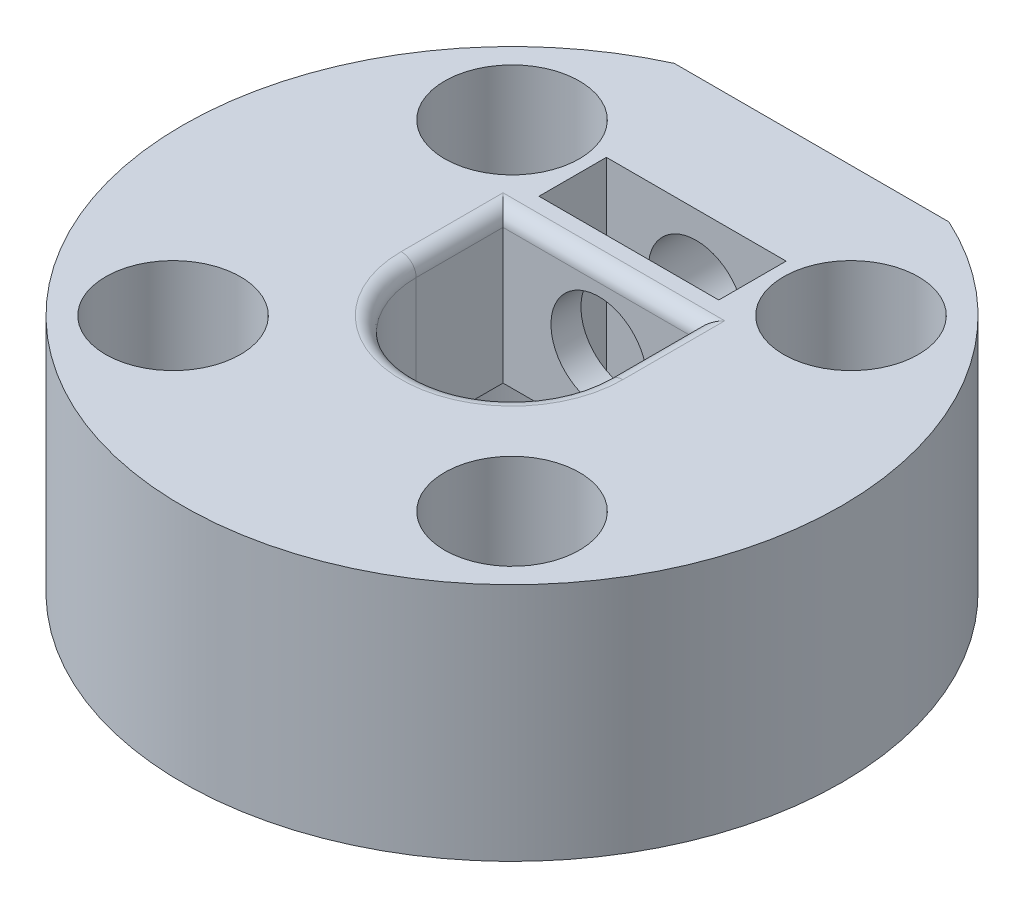
ISO-10303-21;
HEADER;
FILE_DESCRIPTION(('STEP AP214'),'2;1');
FILE_NAME('part.step','',(''),(''),'','','');
FILE_SCHEMA(('AUTOMOTIVE_DESIGN { 1 0 10303 214 1 1 1 1 }'));
ENDSEC;
DATA;
#1=APPLICATION_CONTEXT('core data for automotive mechanical design processes');
#2=APPLICATION_PROTOCOL_DEFINITION('international standard','automotive_design',2000,#1);
#3=PRODUCT_CONTEXT('',#1,'mechanical');
#4=PRODUCT('Part','Part','',(#3));
#5=PRODUCT_RELATED_PRODUCT_CATEGORY('part','',(#4));
#6=PRODUCT_DEFINITION_FORMATION('','',#4);
#7=PRODUCT_DEFINITION_CONTEXT('part definition',#1,'design');
#8=PRODUCT_DEFINITION('design','',#6,#7);
#9=PRODUCT_DEFINITION_SHAPE('','',#8);
#10=(LENGTH_UNIT() NAMED_UNIT(*) SI_UNIT(.MILLI.,.METRE.));
#11=(NAMED_UNIT(*) PLANE_ANGLE_UNIT() SI_UNIT($,.RADIAN.));
#12=(NAMED_UNIT(*) SI_UNIT($,.STERADIAN.) SOLID_ANGLE_UNIT());
#13=UNCERTAINTY_MEASURE_WITH_UNIT(LENGTH_MEASURE(1.E-05),#10,'distance_accuracy_value','');
#14=(GEOMETRIC_REPRESENTATION_CONTEXT(3) GLOBAL_UNCERTAINTY_ASSIGNED_CONTEXT((#13)) GLOBAL_UNIT_ASSIGNED_CONTEXT((#10,
#11,#12)) REPRESENTATION_CONTEXT('',''));
#15=CARTESIAN_POINT('',(0.,0.,0.));
#16=DIRECTION('',(0.,0.,1.));
#17=DIRECTION('',(1.,0.,0.));
#18=AXIS2_PLACEMENT_3D('',#15,#16,#17);
#19=CARTESIAN_POINT('',(0.,8.,0.));
#20=DIRECTION('',(0.,-1.,0.));
#21=DIRECTION('',(0.,0.,-1.));
#22=AXIS2_PLACEMENT_3D('',#19,#20,#21);
#23=CYLINDRICAL_SURFACE('',#22,3.2);
#24=DIRECTION('',(0.,-1.,0.));
#25=VECTOR('',#24,1.);
#26=CARTESIAN_POINT('',(3.2,8.,0.));
#27=LINE('',#26,#25);
#28=CARTESIAN_POINT('',(3.2,7.5,0.));
#29=VERTEX_POINT('',#28);
#30=CARTESIAN_POINT('',(3.2,3.,0.));
#31=VERTEX_POINT('',#30);
#32=EDGE_CURVE('E245',#29,#31,#27,.T.);
#33=ORIENTED_EDGE('',*,*,#32,.T.);
#34=CARTESIAN_POINT('',(0.,3.,0.));
#35=DIRECTION('',(0.,-1.,0.));
#36=DIRECTION('',(0.,0.,-1.));
#37=AXIS2_PLACEMENT_3D('',#34,#35,#36);
#38=CIRCLE('',#37,3.2);
#39=CARTESIAN_POINT('',(-3.2,3.,0.));
#40=VERTEX_POINT('',#39);
#41=EDGE_CURVE('E143',#31,#40,#38,.T.);
#42=ORIENTED_EDGE('',*,*,#41,.T.);
#43=DIRECTION('',(0.,-1.,0.));
#44=VECTOR('',#43,1.);
#45=CARTESIAN_POINT('',(-3.2,8.,0.));
#46=LINE('',#45,#44);
#47=CARTESIAN_POINT('',(-3.2,7.5,0.));
#48=VERTEX_POINT('',#47);
#49=EDGE_CURVE('E236',#48,#40,#46,.T.);
#50=ORIENTED_EDGE('',*,*,#49,.F.);
#51=CARTESIAN_POINT('',(0.,7.5,0.));
#52=DIRECTION('',(0.,1.,0.));
#53=DIRECTION('',(0.,0.,1.));
#54=AXIS2_PLACEMENT_3D('',#51,#52,#53);
#55=CIRCLE('',#54,3.2);
#56=EDGE_CURVE('E280',#48,#29,#55,.T.);
#57=ORIENTED_EDGE('',*,*,#56,.T.);
#58=EDGE_LOOP('',(#33,#42,#50,#57));
#59=FACE_BOUND('',#58,.T.);
#60=ADVANCED_FACE('F35',(#59),#23,.F.);
#61=CARTESIAN_POINT('',(3.2,8.,0.));
#62=DIRECTION('',(-1.,0.,0.));
#63=DIRECTION('',(0.,0.,1.));
#64=AXIS2_PLACEMENT_3D('',#61,#62,#63);
#65=PLANE('',#64);
#66=DIRECTION('',(0.,-1.,0.));
#67=VECTOR('',#66,1.);
#68=CARTESIAN_POINT('',(3.2,8.,-2.9));
#69=LINE('',#68,#67);
#70=CARTESIAN_POINT('',(3.2,7.5,-2.9));
#71=VERTEX_POINT('',#70);
#72=CARTESIAN_POINT('',(3.2,3.,-2.9));
#73=VERTEX_POINT('',#72);
#74=EDGE_CURVE('E242',#71,#73,#69,.T.);
#75=ORIENTED_EDGE('',*,*,#74,.T.);
#76=DIRECTION('',(0.,0.,1.));
#77=VECTOR('',#76,1.);
#78=CARTESIAN_POINT('',(3.2,3.,0.));
#79=LINE('',#78,#77);
#80=EDGE_CURVE('E429',#73,#31,#79,.T.);
#81=ORIENTED_EDGE('',*,*,#80,.T.);
#82=ORIENTED_EDGE('',*,*,#32,.F.);
#83=DIRECTION('',(0.,0.,-1.));
#84=VECTOR('',#83,1.);
#85=CARTESIAN_POINT('',(3.2,7.5,0.));
#86=LINE('',#85,#84);
#87=EDGE_CURVE('E276',#29,#71,#86,.T.);
#88=ORIENTED_EDGE('',*,*,#87,.T.);
#89=EDGE_LOOP('',(#75,#81,#82,#88));
#90=FACE_BOUND('',#89,.T.);
#91=ADVANCED_FACE('F352',(#90),#65,.T.);
#92=CARTESIAN_POINT('',(3.2,8.,-2.9));
#93=DIRECTION('',(0.,0.,1.));
#94=DIRECTION('',(1.,0.,0.));
#95=AXIS2_PLACEMENT_3D('',#92,#93,#94);
#96=PLANE('',#95);
#97=CARTESIAN_POINT('',(0.,5.5,-2.9));
#98=DIRECTION('',(0.,0.,1.));
#99=DIRECTION('',(1.,0.,0.));
#100=AXIS2_PLACEMENT_3D('',#97,#98,#99);
#101=CIRCLE('',#100,1.6);
#102=CARTESIAN_POINT('',(1.6,5.5,-2.9));
#103=VERTEX_POINT('',#102);
#104=EDGE_CURVE('E185',#103,#103,#101,.T.);
#105=ORIENTED_EDGE('',*,*,#104,.F.);
#106=EDGE_LOOP('',(#105));
#107=FACE_BOUND('',#106,.T.);
#108=DIRECTION('',(0.,-1.,0.));
#109=VECTOR('',#108,1.);
#110=CARTESIAN_POINT('',(-3.2,8.,-2.9));
#111=LINE('',#110,#109);
#112=CARTESIAN_POINT('',(-3.2,7.5,-2.9));
#113=VERTEX_POINT('',#112);
#114=CARTESIAN_POINT('',(-3.2,3.,-2.9));
#115=VERTEX_POINT('',#114);
#116=EDGE_CURVE('E239',#113,#115,#111,.T.);
#117=ORIENTED_EDGE('',*,*,#116,.T.);
#118=DIRECTION('',(1.,0.,0.));
#119=VECTOR('',#118,1.);
#120=CARTESIAN_POINT('',(3.2,3.,-2.9));
#121=LINE('',#120,#119);
#122=EDGE_CURVE('E50',#115,#73,#121,.T.);
#123=ORIENTED_EDGE('',*,*,#122,.T.);
#124=ORIENTED_EDGE('',*,*,#74,.F.);
#125=DIRECTION('',(-1.,0.,0.));
#126=VECTOR('',#125,1.);
#127=CARTESIAN_POINT('',(3.2,7.5,-2.9));
#128=LINE('',#127,#126);
#129=EDGE_CURVE('E278',#71,#113,#128,.T.);
#130=ORIENTED_EDGE('',*,*,#129,.T.);
#131=EDGE_LOOP('',(#117,#123,#124,#130));
#132=FACE_BOUND('',#131,.T.);
#133=ADVANCED_FACE('F358',(#107,#132),#96,.T.);
#134=CARTESIAN_POINT('',(-3.2,8.,0.));
#135=DIRECTION('',(1.,0.,0.));
#136=DIRECTION('',(0.,0.,-1.));
#137=AXIS2_PLACEMENT_3D('',#134,#135,#136);
#138=PLANE('',#137);
#139=ORIENTED_EDGE('',*,*,#49,.T.);
#140=DIRECTION('',(0.,0.,-1.));
#141=VECTOR('',#140,1.);
#142=CARTESIAN_POINT('',(-3.2,3.,0.));
#143=LINE('',#142,#141);
#144=EDGE_CURVE('E437',#40,#115,#143,.T.);
#145=ORIENTED_EDGE('',*,*,#144,.T.);
#146=ORIENTED_EDGE('',*,*,#116,.F.);
#147=DIRECTION('',(0.,0.,1.));
#148=VECTOR('',#147,1.);
#149=CARTESIAN_POINT('',(-3.2,7.5,0.));
#150=LINE('',#149,#148);
#151=EDGE_CURVE('E264',#113,#48,#150,.T.);
#152=ORIENTED_EDGE('',*,*,#151,.T.);
#153=EDGE_LOOP('',(#139,#145,#146,#152));
#154=FACE_BOUND('',#153,.T.);
#155=ADVANCED_FACE('F364',(#154),#138,.T.);
#156=CARTESIAN_POINT('',(-3.,0.,-3.9));
#157=DIRECTION('',(0.,0.,1.));
#158=DIRECTION('',(1.,0.,0.));
#159=AXIS2_PLACEMENT_3D('',#156,#157,#158);
#160=PLANE('',#159);
#161=CARTESIAN_POINT('',(0.,5.5,-3.9));
#162=DIRECTION('',(0.,0.,1.));
#163=DIRECTION('',(1.,0.,0.));
#164=AXIS2_PLACEMENT_3D('',#161,#162,#163);
#165=CIRCLE('',#164,1.6);
#166=CARTESIAN_POINT('',(1.6,5.5,-3.9));
#167=VERTEX_POINT('',#166);
#168=EDGE_CURVE('E186',#167,#167,#165,.F.);
#169=ORIENTED_EDGE('',*,*,#168,.F.);
#170=EDGE_LOOP('',(#169));
#171=FACE_BOUND('',#170,.T.);
#172=DIRECTION('',(1.,0.,0.));
#173=VECTOR('',#172,1.);
#174=CARTESIAN_POINT('',(-3.,3.,-3.9));
#175=LINE('',#174,#173);
#176=CARTESIAN_POINT('',(-3.,3.,-3.9));
#177=VERTEX_POINT('',#176);
#178=CARTESIAN_POINT('',(3.,3.,-3.9));
#179=VERTEX_POINT('',#178);
#180=EDGE_CURVE('E299',#177,#179,#175,.T.);
#181=ORIENTED_EDGE('',*,*,#180,.F.);
#182=DIRECTION('',(0.,1.,0.));
#183=VECTOR('',#182,1.);
#184=CARTESIAN_POINT('',(-3.,0.,-3.9));
#185=LINE('',#184,#183);
#186=CARTESIAN_POINT('',(-3.,8.,-3.9));
#187=VERTEX_POINT('',#186);
#188=EDGE_CURVE('E177',#177,#187,#185,.T.);
#189=ORIENTED_EDGE('',*,*,#188,.T.);
#190=DIRECTION('',(1.,0.,0.));
#191=VECTOR('',#190,1.);
#192=CARTESIAN_POINT('',(-3.,8.,-3.9));
#193=LINE('',#192,#191);
#194=CARTESIAN_POINT('',(3.,8.,-3.9));
#195=VERTEX_POINT('',#194);
#196=EDGE_CURVE('E159',#187,#195,#193,.T.);
#197=ORIENTED_EDGE('',*,*,#196,.T.);
#198=DIRECTION('',(0.,1.,0.));
#199=VECTOR('',#198,1.);
#200=CARTESIAN_POINT('',(3.,0.,-3.9));
#201=LINE('',#200,#199);
#202=EDGE_CURVE('E174',#179,#195,#201,.T.);
#203=ORIENTED_EDGE('',*,*,#202,.F.);
#204=EDGE_LOOP('',(#181,#189,#197,#203));
#205=FACE_BOUND('',#204,.T.);
#206=ADVANCED_FACE('F304',(#171,#205),#160,.F.);
#207=CARTESIAN_POINT('',(0.,5.5,-10.));
#208=DIRECTION('',(0.,0.,1.));
#209=DIRECTION('',(1.,0.,0.));
#210=AXIS2_PLACEMENT_3D('',#207,#208,#209);
#211=CYLINDRICAL_SURFACE('',#210,1.6);
#212=ORIENTED_EDGE('',*,*,#168,.T.);
#213=EDGE_LOOP('',(#212));
#214=FACE_BOUND('',#213,.T.);
#215=ORIENTED_EDGE('',*,*,#104,.T.);
#216=EDGE_LOOP('',(#215));
#217=FACE_BOUND('',#216,.T.);
#218=ADVANCED_FACE('F328',(#214,#217),#211,.F.);
#219=CARTESIAN_POINT('',(0.,8.,0.));
#220=DIRECTION('',(0.,1.,0.));
#221=DIRECTION('',(0.,0.,1.));
#222=AXIS2_PLACEMENT_3D('',#219,#220,#221);
#223=PLANE('',#222);
#224=DIRECTION('',(0.,0.,-1.));
#225=VECTOR('',#224,1.);
#226=CARTESIAN_POINT('',(3.,8.,-3.9));
#227=LINE('',#226,#225);
#228=CARTESIAN_POINT('',(3.,8.,-6.15));
#229=VERTEX_POINT('',#228);
#230=EDGE_CURVE('E142',#195,#229,#227,.T.);
#231=ORIENTED_EDGE('',*,*,#230,.F.);
#232=ORIENTED_EDGE('',*,*,#196,.F.);
#233=DIRECTION('',(0.,0.,1.));
#234=VECTOR('',#233,1.);
#235=CARTESIAN_POINT('',(-3.,8.,-3.9));
#236=LINE('',#235,#234);
#237=CARTESIAN_POINT('',(-3.,8.,-6.15));
#238=VERTEX_POINT('',#237);
#239=EDGE_CURVE('E163',#238,#187,#236,.T.);
#240=ORIENTED_EDGE('',*,*,#239,.F.);
#241=DIRECTION('',(-1.,0.,0.));
#242=VECTOR('',#241,1.);
#243=CARTESIAN_POINT('',(-3.,8.,-6.15));
#244=LINE('',#243,#242);
#245=EDGE_CURVE('E169',#229,#238,#244,.T.);
#246=ORIENTED_EDGE('',*,*,#245,.F.);
#247=EDGE_LOOP('',(#231,#232,#240,#246));
#248=FACE_BOUND('',#247,.T.);
#249=DIRECTION('',(0.,0.,1.));
#250=VECTOR('',#249,1.);
#251=CARTESIAN_POINT('',(-3.7,8.,0.));
#252=LINE('',#251,#250);
#253=CARTESIAN_POINT('',(-3.7,8.,0.));
#254=VERTEX_POINT('',#253);
#255=CARTESIAN_POINT('',(-3.7,8.,-3.4));
#256=VERTEX_POINT('',#255);
#257=EDGE_CURVE('E271',#254,#256,#252,.F.);
#258=ORIENTED_EDGE('',*,*,#257,.T.);
#259=DIRECTION('',(-1.,0.,0.));
#260=VECTOR('',#259,1.);
#261=CARTESIAN_POINT('',(0.,8.,-3.4));
#262=LINE('',#261,#260);
#263=CARTESIAN_POINT('',(3.7,8.,-3.4));
#264=VERTEX_POINT('',#263);
#265=EDGE_CURVE('E274',#256,#264,#262,.F.);
#266=ORIENTED_EDGE('',*,*,#265,.T.);
#267=DIRECTION('',(0.,0.,-1.));
#268=VECTOR('',#267,1.);
#269=CARTESIAN_POINT('',(3.7,8.,0.));
#270=LINE('',#269,#268);
#271=CARTESIAN_POINT('',(3.7,8.,0.));
#272=VERTEX_POINT('',#271);
#273=EDGE_CURVE('E269',#264,#272,#270,.F.);
#274=ORIENTED_EDGE('',*,*,#273,.T.);
#275=CARTESIAN_POINT('',(0.,8.,0.));
#276=DIRECTION('',(0.,1.,0.));
#277=DIRECTION('',(0.,0.,1.));
#278=AXIS2_PLACEMENT_3D('',#275,#276,#277);
#279=CIRCLE('',#278,3.7);
#280=EDGE_CURVE('E267',#272,#254,#279,.F.);
#281=ORIENTED_EDGE('',*,*,#280,.T.);
#282=EDGE_LOOP('',(#258,#266,#274,#281));
#283=FACE_BOUND('',#282,.T.);
#284=CARTESIAN_POINT('',(5.65685424949237,8.,-5.65685424949239));
#285=DIRECTION('',(0.,1.,0.));
#286=DIRECTION('',(0.,0.,1.));
#287=AXIS2_PLACEMENT_3D('',#284,#285,#286);
#288=CIRCLE('',#287,2.25);
#289=CARTESIAN_POINT('',(5.65685424949237,8.,-3.40685424949239));
#290=VERTEX_POINT('',#289);
#291=EDGE_CURVE('E187',#290,#290,#288,.T.);
#292=ORIENTED_EDGE('',*,*,#291,.F.);
#293=EDGE_LOOP('',(#292));
#294=FACE_BOUND('',#293,.T.);
#295=CARTESIAN_POINT('',(5.65685424949239,8.,5.65685424949237));
#296=DIRECTION('',(0.,1.,0.));
#297=DIRECTION('',(0.,0.,1.));
#298=AXIS2_PLACEMENT_3D('',#295,#296,#297);
#299=CIRCLE('',#298,2.25);
#300=CARTESIAN_POINT('',(5.65685424949239,8.,7.90685424949237));
#301=VERTEX_POINT('',#300);
#302=EDGE_CURVE('E200',#301,#301,#299,.T.);
#303=ORIENTED_EDGE('',*,*,#302,.F.);
#304=EDGE_LOOP('',(#303));
#305=FACE_BOUND('',#304,.T.);
#306=CARTESIAN_POINT('',(-5.65685424949237,8.,5.65685424949239));
#307=DIRECTION('',(0.,1.,0.));
#308=DIRECTION('',(0.,0.,1.));
#309=AXIS2_PLACEMENT_3D('',#306,#307,#308);
#310=CIRCLE('',#309,2.25);
#311=CARTESIAN_POINT('',(-5.65685424949237,8.,7.90685424949239));
#312=VERTEX_POINT('',#311);
#313=EDGE_CURVE('E212',#312,#312,#310,.T.);
#314=ORIENTED_EDGE('',*,*,#313,.F.);
#315=EDGE_LOOP('',(#314));
#316=FACE_BOUND('',#315,.T.);
#317=CARTESIAN_POINT('',(-5.65685424949239,8.,-5.65685424949237));
#318=DIRECTION('',(0.,1.,0.));
#319=DIRECTION('',(0.,0.,1.));
#320=AXIS2_PLACEMENT_3D('',#317,#318,#319);
#321=CIRCLE('',#320,2.25);
#322=CARTESIAN_POINT('',(-5.65685424949239,8.,-3.40685424949237));
#323=VERTEX_POINT('',#322);
#324=EDGE_CURVE('E224',#323,#323,#321,.T.);
#325=ORIENTED_EDGE('',*,*,#324,.F.);
#326=EDGE_LOOP('',(#325));
#327=FACE_BOUND('',#326,.T.);
#328=CARTESIAN_POINT('',(0.,8.,0.));
#329=DIRECTION('',(0.,1.,0.));
#330=DIRECTION('',(0.,0.,1.));
#331=AXIS2_PLACEMENT_3D('',#328,#329,#330);
#332=CIRCLE('',#331,11.);
#333=CARTESIAN_POINT('',(-4.58257569495584,8.,-10.));
#334=VERTEX_POINT('',#333);
#335=CARTESIAN_POINT('',(4.58257569495584,8.,-10.));
#336=VERTEX_POINT('',#335);
#337=EDGE_CURVE('E249',#334,#336,#332,.T.);
#338=ORIENTED_EDGE('',*,*,#337,.T.);
#339=DIRECTION('',(-1.,0.,0.));
#340=VECTOR('',#339,1.);
#341=CARTESIAN_POINT('',(4.58257569495584,8.,-10.));
#342=LINE('',#341,#340);
#343=EDGE_CURVE('E252',#336,#334,#342,.T.);
#344=ORIENTED_EDGE('',*,*,#343,.T.);
#345=EDGE_LOOP('',(#338,#344));
#346=FACE_BOUND('',#345,.T.);
#347=ADVANCED_FACE('F314',(#248,#283,#294,#305,#316,#327,#346),#223,.T.);
#348=CARTESIAN_POINT('',(0.,0.,0.));
#349=DIRECTION('',(0.,1.,0.));
#350=DIRECTION('',(0.,0.,1.));
#351=AXIS2_PLACEMENT_3D('',#348,#349,#350);
#352=PLANE('',#351);
#353=DIRECTION('',(0.,0.,1.));
#354=VECTOR('',#353,1.);
#355=CARTESIAN_POINT('',(-3.,0.,-3.9));
#356=LINE('',#355,#354);
#357=CARTESIAN_POINT('',(-3.,0.,-6.15));
#358=VERTEX_POINT('',#357);
#359=CARTESIAN_POINT('',(-3.,0.,-4.60977222864679));
#360=VERTEX_POINT('',#359);
#361=EDGE_CURVE('E152',#358,#360,#356,.T.);
#362=ORIENTED_EDGE('',*,*,#361,.T.);
#363=CARTESIAN_POINT('',(-1.04093892556476E-12,0.,-1.26348062682966E-12));
#364=DIRECTION('',(0.,-1.,0.));
#365=DIRECTION('',(0.,0.,-1.));
#366=AXIS2_PLACEMENT_3D('',#363,#364,#365);
#367=CIRCLE('',#366,5.49999999999866);
#368=CARTESIAN_POINT('',(3.,0.,-4.60977222864543));
#369=VERTEX_POINT('',#368);
#370=EDGE_CURVE('E138',#369,#360,#367,.T.);
#371=ORIENTED_EDGE('',*,*,#370,.F.);
#372=DIRECTION('',(0.,0.,-1.));
#373=VECTOR('',#372,1.);
#374=CARTESIAN_POINT('',(3.,0.,-3.9));
#375=LINE('',#374,#373);
#376=CARTESIAN_POINT('',(3.,0.,-6.15));
#377=VERTEX_POINT('',#376);
#378=EDGE_CURVE('E150',#369,#377,#375,.T.);
#379=ORIENTED_EDGE('',*,*,#378,.T.);
#380=DIRECTION('',(-1.,0.,0.));
#381=VECTOR('',#380,1.);
#382=CARTESIAN_POINT('',(-3.,0.,-6.15));
#383=LINE('',#382,#381);
#384=EDGE_CURVE('E158',#377,#358,#383,.T.);
#385=ORIENTED_EDGE('',*,*,#384,.T.);
#386=EDGE_LOOP('',(#362,#371,#379,#385));
#387=FACE_BOUND('',#386,.T.);
#388=CARTESIAN_POINT('',(5.65685424949237,0.,-5.65685424949239));
#389=DIRECTION('',(0.,1.,0.));
#390=DIRECTION('',(0.,0.,1.));
#391=AXIS2_PLACEMENT_3D('',#388,#389,#390);
#392=CIRCLE('',#391,1.25);
#393=CARTESIAN_POINT('',(5.65685424949237,0.,-4.40685424949239));
#394=VERTEX_POINT('',#393);
#395=EDGE_CURVE('E197',#394,#394,#392,.T.);
#396=ORIENTED_EDGE('',*,*,#395,.T.);
#397=EDGE_LOOP('',(#396));
#398=FACE_BOUND('',#397,.T.);
#399=CARTESIAN_POINT('',(5.65685424949239,0.,5.65685424949237));
#400=DIRECTION('',(0.,1.,0.));
#401=DIRECTION('',(0.,0.,1.));
#402=AXIS2_PLACEMENT_3D('',#399,#400,#401);
#403=CIRCLE('',#402,1.25);
#404=CARTESIAN_POINT('',(5.65685424949239,0.,6.90685424949237));
#405=VERTEX_POINT('',#404);
#406=EDGE_CURVE('E209',#405,#405,#403,.T.);
#407=ORIENTED_EDGE('',*,*,#406,.T.);
#408=EDGE_LOOP('',(#407));
#409=FACE_BOUND('',#408,.T.);
#410=CARTESIAN_POINT('',(-5.65685424949237,0.,5.65685424949239));
#411=DIRECTION('',(0.,1.,0.));
#412=DIRECTION('',(0.,0.,1.));
#413=AXIS2_PLACEMENT_3D('',#410,#411,#412);
#414=CIRCLE('',#413,1.25);
#415=CARTESIAN_POINT('',(-5.65685424949237,0.,6.90685424949239));
#416=VERTEX_POINT('',#415);
#417=EDGE_CURVE('E221',#416,#416,#414,.T.);
#418=ORIENTED_EDGE('',*,*,#417,.T.);
#419=EDGE_LOOP('',(#418));
#420=FACE_BOUND('',#419,.T.);
#421=CARTESIAN_POINT('',(-5.65685424949239,0.,-5.65685424949237));
#422=DIRECTION('',(0.,1.,0.));
#423=DIRECTION('',(0.,0.,1.));
#424=AXIS2_PLACEMENT_3D('',#421,#422,#423);
#425=CIRCLE('',#424,1.25);
#426=CARTESIAN_POINT('',(-5.65685424949239,0.,-4.40685424949237));
#427=VERTEX_POINT('',#426);
#428=EDGE_CURVE('E233',#427,#427,#425,.T.);
#429=ORIENTED_EDGE('',*,*,#428,.T.);
#430=EDGE_LOOP('',(#429));
#431=FACE_BOUND('',#430,.T.);
#432=CARTESIAN_POINT('',(0.,0.,0.));
#433=DIRECTION('',(0.,1.,0.));
#434=DIRECTION('',(0.,0.,1.));
#435=AXIS2_PLACEMENT_3D('',#432,#433,#434);
#436=CIRCLE('',#435,11.);
#437=CARTESIAN_POINT('',(-4.58257569495584,0.,-10.));
#438=VERTEX_POINT('',#437);
#439=CARTESIAN_POINT('',(4.58257569495584,0.,-10.));
#440=VERTEX_POINT('',#439);
#441=EDGE_CURVE('E248',#438,#440,#436,.T.);
#442=ORIENTED_EDGE('',*,*,#441,.F.);
#443=DIRECTION('',(-1.,0.,0.));
#444=VECTOR('',#443,1.);
#445=CARTESIAN_POINT('',(4.58257569495584,0.,-10.));
#446=LINE('',#445,#444);
#447=EDGE_CURVE('E253',#440,#438,#446,.T.);
#448=ORIENTED_EDGE('',*,*,#447,.F.);
#449=EDGE_LOOP('',(#442,#448));
#450=FACE_BOUND('',#449,.T.);
#451=ADVANCED_FACE('F147',(#387,#398,#409,#420,#431,#450),#352,.F.);
#452=CARTESIAN_POINT('',(0.,8.,0.));
#453=DIRECTION('',(0.,-1.,0.));
#454=DIRECTION('',(0.,0.,-1.));
#455=AXIS2_PLACEMENT_3D('',#452,#453,#454);
#456=CYLINDRICAL_SURFACE('',#455,11.);
#457=ORIENTED_EDGE('',*,*,#441,.T.);
#458=DIRECTION('',(0.,-1.,0.));
#459=VECTOR('',#458,1.);
#460=CARTESIAN_POINT('',(4.58257569495584,8.,-10.));
#461=LINE('',#460,#459);
#462=EDGE_CURVE('E261',#336,#440,#461,.T.);
#463=ORIENTED_EDGE('',*,*,#462,.F.);
#464=ORIENTED_EDGE('',*,*,#337,.F.);
#465=DIRECTION('',(0.,-1.,0.));
#466=VECTOR('',#465,1.);
#467=CARTESIAN_POINT('',(-4.58257569495584,8.,-10.));
#468=LINE('',#467,#466);
#469=EDGE_CURVE('E255',#334,#438,#468,.T.);
#470=ORIENTED_EDGE('',*,*,#469,.T.);
#471=EDGE_LOOP('',(#457,#463,#464,#470));
#472=FACE_BOUND('',#471,.T.);
#473=ADVANCED_FACE('F335',(#472),#456,.T.);
#474=CARTESIAN_POINT('',(4.58257569495584,8.,-10.));
#475=DIRECTION('',(0.,0.,1.));
#476=DIRECTION('',(1.,0.,0.));
#477=AXIS2_PLACEMENT_3D('',#474,#475,#476);
#478=PLANE('',#477);
#479=CARTESIAN_POINT('',(0.,5.5,-10.));
#480=DIRECTION('',(0.,0.,1.));
#481=DIRECTION('',(1.,0.,0.));
#482=AXIS2_PLACEMENT_3D('',#479,#480,#481);
#483=CIRCLE('',#482,1.6);
#484=CARTESIAN_POINT('',(1.6,5.5,-10.));
#485=VERTEX_POINT('',#484);
#486=EDGE_CURVE('E182',#485,#485,#483,.T.);
#487=ORIENTED_EDGE('',*,*,#486,.T.);
#488=EDGE_LOOP('',(#487));
#489=FACE_BOUND('',#488,.T.);
#490=ORIENTED_EDGE('',*,*,#447,.T.);
#491=ORIENTED_EDGE('',*,*,#469,.F.);
#492=ORIENTED_EDGE('',*,*,#343,.F.);
#493=ORIENTED_EDGE('',*,*,#462,.T.);
#494=EDGE_LOOP('',(#490,#491,#492,#493));
#495=FACE_BOUND('',#494,.T.);
#496=ADVANCED_FACE('F331',(#489,#495),#478,.F.);
#497=CARTESIAN_POINT('',(-5.65685424949239,8.,-5.65685424949237));
#498=DIRECTION('',(0.,1.,0.));
#499=DIRECTION('',(0.,0.,1.));
#500=AXIS2_PLACEMENT_3D('',#497,#498,#499);
#501=CYLINDRICAL_SURFACE('',#500,1.25);
#502=ORIENTED_EDGE('',*,*,#428,.F.);
#503=EDGE_LOOP('',(#502));
#504=FACE_BOUND('',#503,.T.);
#505=CARTESIAN_POINT('',(-5.65685424949239,1.5,-5.65685424949237));
#506=DIRECTION('',(0.,1.,0.));
#507=DIRECTION('',(0.,0.,1.));
#508=AXIS2_PLACEMENT_3D('',#505,#506,#507);
#509=CIRCLE('',#508,1.25);
#510=CARTESIAN_POINT('',(-5.65685424949239,1.5,-4.40685424949237));
#511=VERTEX_POINT('',#510);
#512=EDGE_CURVE('E230',#511,#511,#509,.T.);
#513=ORIENTED_EDGE('',*,*,#512,.T.);
#514=EDGE_LOOP('',(#513));
#515=FACE_BOUND('',#514,.T.);
#516=ADVANCED_FACE('F334',(#504,#515),#501,.F.);
#517=CARTESIAN_POINT('',(-4.40685424949239,1.5,-5.65685424949237));
#518=DIRECTION('',(0.,-1.,0.));
#519=DIRECTION('',(0.,0.,-1.));
#520=AXIS2_PLACEMENT_3D('',#517,#518,#519);
#521=PLANE('',#520);
#522=ORIENTED_EDGE('',*,*,#512,.F.);
#523=EDGE_LOOP('',(#522));
#524=FACE_BOUND('',#523,.T.);
#525=CARTESIAN_POINT('',(-5.65685424949239,1.5,-5.65685424949237));
#526=DIRECTION('',(0.,1.,0.));
#527=DIRECTION('',(0.,0.,1.));
#528=AXIS2_PLACEMENT_3D('',#525,#526,#527);
#529=CIRCLE('',#528,2.25);
#530=CARTESIAN_POINT('',(-5.65685424949239,1.5,-3.40685424949237));
#531=VERTEX_POINT('',#530);
#532=EDGE_CURVE('E227',#531,#531,#529,.T.);
#533=ORIENTED_EDGE('',*,*,#532,.T.);
#534=EDGE_LOOP('',(#533));
#535=FACE_BOUND('',#534,.T.);
#536=ADVANCED_FACE('F371',(#524,#535),#521,.F.);
#537=CARTESIAN_POINT('',(-5.65685424949239,8.,-5.65685424949237));
#538=DIRECTION('',(0.,1.,0.));
#539=DIRECTION('',(0.,0.,1.));
#540=AXIS2_PLACEMENT_3D('',#537,#538,#539);
#541=CYLINDRICAL_SURFACE('',#540,2.25);
#542=ORIENTED_EDGE('',*,*,#532,.F.);
#543=EDGE_LOOP('',(#542));
#544=FACE_BOUND('',#543,.T.);
#545=ORIENTED_EDGE('',*,*,#324,.T.);
#546=EDGE_LOOP('',(#545));
#547=FACE_BOUND('',#546,.T.);
#548=ADVANCED_FACE('F375',(#544,#547),#541,.F.);
#549=CARTESIAN_POINT('',(-5.65685424949237,8.,5.65685424949239));
#550=DIRECTION('',(0.,1.,0.));
#551=DIRECTION('',(0.,0.,1.));
#552=AXIS2_PLACEMENT_3D('',#549,#550,#551);
#553=CYLINDRICAL_SURFACE('',#552,1.25);
#554=ORIENTED_EDGE('',*,*,#417,.F.);
#555=EDGE_LOOP('',(#554));
#556=FACE_BOUND('',#555,.T.);
#557=CARTESIAN_POINT('',(-5.65685424949237,1.5,5.65685424949239));
#558=DIRECTION('',(0.,1.,0.));
#559=DIRECTION('',(0.,0.,1.));
#560=AXIS2_PLACEMENT_3D('',#557,#558,#559);
#561=CIRCLE('',#560,1.25);
#562=CARTESIAN_POINT('',(-5.65685424949237,1.5,6.90685424949239));
#563=VERTEX_POINT('',#562);
#564=EDGE_CURVE('E218',#563,#563,#561,.T.);
#565=ORIENTED_EDGE('',*,*,#564,.T.);
#566=EDGE_LOOP('',(#565));
#567=FACE_BOUND('',#566,.T.);
#568=ADVANCED_FACE('F379',(#556,#567),#553,.F.);
#569=CARTESIAN_POINT('',(-4.40685424949237,1.5,5.65685424949239));
#570=DIRECTION('',(0.,-1.,0.));
#571=DIRECTION('',(0.,0.,-1.));
#572=AXIS2_PLACEMENT_3D('',#569,#570,#571);
#573=PLANE('',#572);
#574=ORIENTED_EDGE('',*,*,#564,.F.);
#575=EDGE_LOOP('',(#574));
#576=FACE_BOUND('',#575,.T.);
#577=CARTESIAN_POINT('',(-5.65685424949237,1.5,5.65685424949239));
#578=DIRECTION('',(0.,1.,0.));
#579=DIRECTION('',(0.,0.,1.));
#580=AXIS2_PLACEMENT_3D('',#577,#578,#579);
#581=CIRCLE('',#580,2.25);
#582=CARTESIAN_POINT('',(-5.65685424949237,1.5,7.90685424949239));
#583=VERTEX_POINT('',#582);
#584=EDGE_CURVE('E215',#583,#583,#581,.T.);
#585=ORIENTED_EDGE('',*,*,#584,.T.);
#586=EDGE_LOOP('',(#585));
#587=FACE_BOUND('',#586,.T.);
#588=ADVANCED_FACE('F383',(#576,#587),#573,.F.);
#589=CARTESIAN_POINT('',(-5.65685424949237,8.,5.65685424949239));
#590=DIRECTION('',(0.,1.,0.));
#591=DIRECTION('',(0.,0.,1.));
#592=AXIS2_PLACEMENT_3D('',#589,#590,#591);
#593=CYLINDRICAL_SURFACE('',#592,2.25);
#594=ORIENTED_EDGE('',*,*,#584,.F.);
#595=EDGE_LOOP('',(#594));
#596=FACE_BOUND('',#595,.T.);
#597=ORIENTED_EDGE('',*,*,#313,.T.);
#598=EDGE_LOOP('',(#597));
#599=FACE_BOUND('',#598,.T.);
#600=ADVANCED_FACE('F387',(#596,#599),#593,.F.);
#601=CARTESIAN_POINT('',(5.65685424949239,8.,5.65685424949237));
#602=DIRECTION('',(0.,1.,0.));
#603=DIRECTION('',(0.,0.,1.));
#604=AXIS2_PLACEMENT_3D('',#601,#602,#603);
#605=CYLINDRICAL_SURFACE('',#604,1.25);
#606=ORIENTED_EDGE('',*,*,#406,.F.);
#607=EDGE_LOOP('',(#606));
#608=FACE_BOUND('',#607,.T.);
#609=CARTESIAN_POINT('',(5.65685424949239,1.5,5.65685424949237));
#610=DIRECTION('',(0.,1.,0.));
#611=DIRECTION('',(0.,0.,1.));
#612=AXIS2_PLACEMENT_3D('',#609,#610,#611);
#613=CIRCLE('',#612,1.25);
#614=CARTESIAN_POINT('',(5.65685424949239,1.5,6.90685424949237));
#615=VERTEX_POINT('',#614);
#616=EDGE_CURVE('E206',#615,#615,#613,.T.);
#617=ORIENTED_EDGE('',*,*,#616,.T.);
#618=EDGE_LOOP('',(#617));
#619=FACE_BOUND('',#618,.T.);
#620=ADVANCED_FACE('F391',(#608,#619),#605,.F.);
#621=CARTESIAN_POINT('',(6.90685424949239,1.5,5.65685424949237));
#622=DIRECTION('',(0.,-1.,0.));
#623=DIRECTION('',(0.,0.,-1.));
#624=AXIS2_PLACEMENT_3D('',#621,#622,#623);
#625=PLANE('',#624);
#626=ORIENTED_EDGE('',*,*,#616,.F.);
#627=EDGE_LOOP('',(#626));
#628=FACE_BOUND('',#627,.T.);
#629=CARTESIAN_POINT('',(5.65685424949239,1.5,5.65685424949237));
#630=DIRECTION('',(0.,1.,0.));
#631=DIRECTION('',(0.,0.,1.));
#632=AXIS2_PLACEMENT_3D('',#629,#630,#631);
#633=CIRCLE('',#632,2.25);
#634=CARTESIAN_POINT('',(5.65685424949239,1.5,7.90685424949237));
#635=VERTEX_POINT('',#634);
#636=EDGE_CURVE('E203',#635,#635,#633,.T.);
#637=ORIENTED_EDGE('',*,*,#636,.T.);
#638=EDGE_LOOP('',(#637));
#639=FACE_BOUND('',#638,.T.);
#640=ADVANCED_FACE('F395',(#628,#639),#625,.F.);
#641=CARTESIAN_POINT('',(5.65685424949239,8.,5.65685424949237));
#642=DIRECTION('',(0.,1.,0.));
#643=DIRECTION('',(0.,0.,1.));
#644=AXIS2_PLACEMENT_3D('',#641,#642,#643);
#645=CYLINDRICAL_SURFACE('',#644,2.25);
#646=ORIENTED_EDGE('',*,*,#636,.F.);
#647=EDGE_LOOP('',(#646));
#648=FACE_BOUND('',#647,.T.);
#649=ORIENTED_EDGE('',*,*,#302,.T.);
#650=EDGE_LOOP('',(#649));
#651=FACE_BOUND('',#650,.T.);
#652=ADVANCED_FACE('F399',(#648,#651),#645,.F.);
#653=CARTESIAN_POINT('',(5.65685424949237,8.,-5.65685424949239));
#654=DIRECTION('',(0.,1.,0.));
#655=DIRECTION('',(0.,0.,1.));
#656=AXIS2_PLACEMENT_3D('',#653,#654,#655);
#657=CYLINDRICAL_SURFACE('',#656,1.25);
#658=ORIENTED_EDGE('',*,*,#395,.F.);
#659=EDGE_LOOP('',(#658));
#660=FACE_BOUND('',#659,.T.);
#661=CARTESIAN_POINT('',(5.65685424949237,1.5,-5.65685424949239));
#662=DIRECTION('',(0.,1.,0.));
#663=DIRECTION('',(0.,0.,1.));
#664=AXIS2_PLACEMENT_3D('',#661,#662,#663);
#665=CIRCLE('',#664,1.25);
#666=CARTESIAN_POINT('',(5.65685424949237,1.5,-4.40685424949239));
#667=VERTEX_POINT('',#666);
#668=EDGE_CURVE('E194',#667,#667,#665,.T.);
#669=ORIENTED_EDGE('',*,*,#668,.T.);
#670=EDGE_LOOP('',(#669));
#671=FACE_BOUND('',#670,.T.);
#672=ADVANCED_FACE('F403',(#660,#671),#657,.F.);
#673=CARTESIAN_POINT('',(6.90685424949237,1.5,-5.65685424949239));
#674=DIRECTION('',(0.,-1.,0.));
#675=DIRECTION('',(0.,0.,-1.));
#676=AXIS2_PLACEMENT_3D('',#673,#674,#675);
#677=PLANE('',#676);
#678=ORIENTED_EDGE('',*,*,#668,.F.);
#679=EDGE_LOOP('',(#678));
#680=FACE_BOUND('',#679,.T.);
#681=CARTESIAN_POINT('',(5.65685424949237,1.5,-5.65685424949239));
#682=DIRECTION('',(0.,1.,0.));
#683=DIRECTION('',(0.,0.,1.));
#684=AXIS2_PLACEMENT_3D('',#681,#682,#683);
#685=CIRCLE('',#684,2.25);
#686=CARTESIAN_POINT('',(5.65685424949237,1.5,-3.40685424949239));
#687=VERTEX_POINT('',#686);
#688=EDGE_CURVE('E190',#687,#687,#685,.T.);
#689=ORIENTED_EDGE('',*,*,#688,.T.);
#690=EDGE_LOOP('',(#689));
#691=FACE_BOUND('',#690,.T.);
#692=ADVANCED_FACE('F407',(#680,#691),#677,.F.);
#693=CARTESIAN_POINT('',(5.65685424949237,8.,-5.65685424949239));
#694=DIRECTION('',(0.,1.,0.));
#695=DIRECTION('',(0.,0.,1.));
#696=AXIS2_PLACEMENT_3D('',#693,#694,#695);
#697=CYLINDRICAL_SURFACE('',#696,2.25);
#698=ORIENTED_EDGE('',*,*,#688,.F.);
#699=EDGE_LOOP('',(#698));
#700=FACE_BOUND('',#699,.T.);
#701=ORIENTED_EDGE('',*,*,#291,.T.);
#702=EDGE_LOOP('',(#701));
#703=FACE_BOUND('',#702,.T.);
#704=ADVANCED_FACE('F411',(#700,#703),#697,.F.);
#705=CARTESIAN_POINT('',(3.7,7.5,0.));
#706=DIRECTION('',(0.,0.,-1.));
#707=DIRECTION('',(-1.,0.,0.));
#708=AXIS2_PLACEMENT_3D('',#705,#706,#707);
#709=CYLINDRICAL_SURFACE('',#708,0.5);
#710=CARTESIAN_POINT('',(3.7,7.5,0.));
#711=DIRECTION('',(0.,0.,1.));
#712=DIRECTION('',(1.,0.,0.));
#713=AXIS2_PLACEMENT_3D('',#710,#711,#712);
#714=CIRCLE('',#713,0.5);
#715=EDGE_CURVE('E286',#272,#29,#714,.T.);
#716=ORIENTED_EDGE('',*,*,#715,.F.);
#717=ORIENTED_EDGE('',*,*,#273,.F.);
#718=CARTESIAN_POINT('',(3.7,7.5,-3.4));
#719=DIRECTION('',(-0.707106781186548,0.,-0.707106781186547));
#720=DIRECTION('',(0.707106781186547,0.,-0.707106781186548));
#721=AXIS2_PLACEMENT_3D('',#718,#719,#720);
#722=ELLIPSE('',#721,0.707106781186547,0.5);
#723=EDGE_CURVE('E191',#71,#264,#722,.T.);
#724=ORIENTED_EDGE('',*,*,#723,.F.);
#725=ORIENTED_EDGE('',*,*,#87,.F.);
#726=EDGE_LOOP('',(#716,#717,#724,#725));
#727=FACE_BOUND('',#726,.T.);
#728=ADVANCED_FACE('F37',(#727),#709,.T.);
#729=CARTESIAN_POINT('',(3.2,7.5,-3.4));
#730=DIRECTION('',(-1.,0.,0.));
#731=DIRECTION('',(0.,0.,1.));
#732=AXIS2_PLACEMENT_3D('',#729,#730,#731);
#733=CYLINDRICAL_SURFACE('',#732,0.5);
#734=ORIENTED_EDGE('',*,*,#723,.T.);
#735=ORIENTED_EDGE('',*,*,#265,.F.);
#736=CARTESIAN_POINT('',(-3.7,7.5,-3.4));
#737=DIRECTION('',(-0.707106781186548,0.,0.707106781186547));
#738=DIRECTION('',(0.707106781186547,0.,0.707106781186548));
#739=AXIS2_PLACEMENT_3D('',#736,#737,#738);
#740=ELLIPSE('',#739,0.707106781186547,0.5);
#741=EDGE_CURVE('E284',#113,#256,#740,.T.);
#742=ORIENTED_EDGE('',*,*,#741,.F.);
#743=ORIENTED_EDGE('',*,*,#129,.F.);
#744=EDGE_LOOP('',(#734,#735,#742,#743));
#745=FACE_BOUND('',#744,.T.);
#746=ADVANCED_FACE('F456',(#745),#733,.T.);
#747=CARTESIAN_POINT('',(0.,7.5,0.));
#748=DIRECTION('',(0.,1.,0.));
#749=DIRECTION('',(0.,0.,1.));
#750=AXIS2_PLACEMENT_3D('',#747,#748,#749);
#751=TOROIDAL_SURFACE('',#750,3.7,0.5);
#752=ORIENTED_EDGE('',*,*,#715,.T.);
#753=ORIENTED_EDGE('',*,*,#56,.F.);
#754=CARTESIAN_POINT('',(-3.7,7.5,0.));
#755=DIRECTION('',(0.,0.,-1.));
#756=DIRECTION('',(-1.,0.,0.));
#757=AXIS2_PLACEMENT_3D('',#754,#755,#756);
#758=CIRCLE('',#757,0.5);
#759=EDGE_CURVE('E282',#254,#48,#758,.T.);
#760=ORIENTED_EDGE('',*,*,#759,.F.);
#761=ORIENTED_EDGE('',*,*,#280,.F.);
#762=EDGE_LOOP('',(#752,#753,#760,#761));
#763=FACE_BOUND('',#762,.T.);
#764=ADVANCED_FACE('F447',(#763),#751,.T.);
#765=CARTESIAN_POINT('',(-3.7,7.5,0.));
#766=DIRECTION('',(0.,0.,1.));
#767=DIRECTION('',(1.,0.,0.));
#768=AXIS2_PLACEMENT_3D('',#765,#766,#767);
#769=CYLINDRICAL_SURFACE('',#768,0.5);
#770=ORIENTED_EDGE('',*,*,#741,.T.);
#771=ORIENTED_EDGE('',*,*,#257,.F.);
#772=ORIENTED_EDGE('',*,*,#759,.T.);
#773=ORIENTED_EDGE('',*,*,#151,.F.);
#774=EDGE_LOOP('',(#770,#771,#772,#773));
#775=FACE_BOUND('',#774,.T.);
#776=ADVANCED_FACE('F326',(#775),#769,.T.);
#777=CARTESIAN_POINT('',(0.,5.5,-6.15));
#778=DIRECTION('',(0.,0.,-1.));
#779=DIRECTION('',(-1.,0.,0.));
#780=AXIS2_PLACEMENT_3D('',#777,#778,#779);
#781=CIRCLE('',#780,1.6);
#782=CARTESIAN_POINT('',(-1.6,5.5,-6.15));
#783=VERTEX_POINT('',#782);
#784=EDGE_CURVE('E176',#783,#783,#781,.F.);
#785=ORIENTED_EDGE('',*,*,#784,.T.);
#786=EDGE_LOOP('',(#785));
#787=FACE_BOUND('',#786,.T.);
#788=ORIENTED_EDGE('',*,*,#486,.F.);
#789=EDGE_LOOP('',(#788));
#790=FACE_BOUND('',#789,.T.);
#791=ADVANCED_FACE('F320',(#787,#790),#211,.F.);
#792=CARTESIAN_POINT('',(-3.,0.,-6.15));
#793=DIRECTION('',(0.,0.,-1.));
#794=DIRECTION('',(-1.,0.,0.));
#795=AXIS2_PLACEMENT_3D('',#792,#793,#794);
#796=PLANE('',#795);
#797=ORIENTED_EDGE('',*,*,#245,.T.);
#798=DIRECTION('',(0.,1.,0.));
#799=VECTOR('',#798,1.);
#800=CARTESIAN_POINT('',(-3.,0.,-6.15));
#801=LINE('',#800,#799);
#802=EDGE_CURVE('E179',#358,#238,#801,.T.);
#803=ORIENTED_EDGE('',*,*,#802,.F.);
#804=ORIENTED_EDGE('',*,*,#384,.F.);
#805=DIRECTION('',(0.,1.,0.));
#806=VECTOR('',#805,1.);
#807=CARTESIAN_POINT('',(3.,0.,-6.15));
#808=LINE('',#807,#806);
#809=EDGE_CURVE('E156',#377,#229,#808,.T.);
#810=ORIENTED_EDGE('',*,*,#809,.T.);
#811=EDGE_LOOP('',(#797,#803,#804,#810));
#812=FACE_BOUND('',#811,.T.);
#813=ORIENTED_EDGE('',*,*,#784,.F.);
#814=EDGE_LOOP('',(#813));
#815=FACE_BOUND('',#814,.T.);
#816=ADVANCED_FACE('F317',(#812,#815),#796,.F.);
#817=CARTESIAN_POINT('',(3.,0.,-3.9));
#818=DIRECTION('',(1.,0.,0.));
#819=DIRECTION('',(0.,0.,-1.));
#820=AXIS2_PLACEMENT_3D('',#817,#818,#819);
#821=PLANE('',#820);
#822=ORIENTED_EDGE('',*,*,#378,.F.);
#823=DIRECTION('',(0.,-1.,0.));
#824=VECTOR('',#823,1.);
#825=CARTESIAN_POINT('',(3.,3.,-4.60977222864543));
#826=LINE('',#825,#824);
#827=CARTESIAN_POINT('',(3.,3.,-4.60977222864543));
#828=VERTEX_POINT('',#827);
#829=EDGE_CURVE('E135',#369,#828,#826,.F.);
#830=ORIENTED_EDGE('',*,*,#829,.T.);
#831=DIRECTION('',(0.,0.,-1.));
#832=VECTOR('',#831,1.);
#833=CARTESIAN_POINT('',(3.,3.,-3.9));
#834=LINE('',#833,#832);
#835=EDGE_CURVE('E305',#179,#828,#834,.T.);
#836=ORIENTED_EDGE('',*,*,#835,.F.);
#837=ORIENTED_EDGE('',*,*,#202,.T.);
#838=ORIENTED_EDGE('',*,*,#230,.T.);
#839=ORIENTED_EDGE('',*,*,#809,.F.);
#840=EDGE_LOOP('',(#822,#830,#836,#837,#838,#839));
#841=FACE_BOUND('',#840,.T.);
#842=ADVANCED_FACE('F154',(#841),#821,.F.);
#843=CARTESIAN_POINT('',(-3.,0.,-3.9));
#844=DIRECTION('',(-1.,0.,0.));
#845=DIRECTION('',(0.,0.,1.));
#846=AXIS2_PLACEMENT_3D('',#843,#844,#845);
#847=PLANE('',#846);
#848=DIRECTION('',(0.,0.,1.));
#849=VECTOR('',#848,1.);
#850=CARTESIAN_POINT('',(-3.,3.,-3.9));
#851=LINE('',#850,#849);
#852=CARTESIAN_POINT('',(-3.,3.,-4.60977222864679));
#853=VERTEX_POINT('',#852);
#854=EDGE_CURVE('E43',#853,#177,#851,.T.);
#855=ORIENTED_EDGE('',*,*,#854,.F.);
#856=DIRECTION('',(0.,-1.,0.));
#857=VECTOR('',#856,1.);
#858=CARTESIAN_POINT('',(-3.,3.,-4.60977222864679));
#859=LINE('',#858,#857);
#860=EDGE_CURVE('E11',#853,#360,#859,.T.);
#861=ORIENTED_EDGE('',*,*,#860,.T.);
#862=ORIENTED_EDGE('',*,*,#361,.F.);
#863=ORIENTED_EDGE('',*,*,#802,.T.);
#864=ORIENTED_EDGE('',*,*,#239,.T.);
#865=ORIENTED_EDGE('',*,*,#188,.F.);
#866=EDGE_LOOP('',(#855,#861,#862,#863,#864,#865));
#867=FACE_BOUND('',#866,.T.);
#868=ADVANCED_FACE('F307',(#867),#847,.F.);
#869=CARTESIAN_POINT('',(-1.04093892556476E-12,3.,-1.26348062682966E-12));
#870=DIRECTION('',(0.,-1.,0.));
#871=DIRECTION('',(0.,0.,-1.));
#872=AXIS2_PLACEMENT_3D('',#869,#870,#871);
#873=CYLINDRICAL_SURFACE('',#872,5.49999999999866);
#874=ORIENTED_EDGE('',*,*,#370,.T.);
#875=ORIENTED_EDGE('',*,*,#860,.F.);
#876=CARTESIAN_POINT('',(-1.04093892556476E-12,3.,-1.26348062682966E-12));
#877=DIRECTION('',(0.,-1.,0.));
#878=DIRECTION('',(0.,0.,-1.));
#879=AXIS2_PLACEMENT_3D('',#876,#877,#878);
#880=CIRCLE('',#879,5.49999999999866);
#881=EDGE_CURVE('E58',#828,#853,#880,.T.);
#882=ORIENTED_EDGE('',*,*,#881,.F.);
#883=ORIENTED_EDGE('',*,*,#829,.F.);
#884=EDGE_LOOP('',(#874,#875,#882,#883));
#885=FACE_BOUND('',#884,.T.);
#886=ADVANCED_FACE('F137',(#885),#873,.F.);
#887=CARTESIAN_POINT('',(-1.04093892556476E-12,3.,-1.26348062682966E-12));
#888=DIRECTION('',(0.,-1.,0.));
#889=DIRECTION('',(0.,0.,-1.));
#890=AXIS2_PLACEMENT_3D('',#887,#888,#889);
#891=PLANE('',#890);
#892=ORIENTED_EDGE('',*,*,#80,.F.);
#893=ORIENTED_EDGE('',*,*,#122,.F.);
#894=ORIENTED_EDGE('',*,*,#144,.F.);
#895=ORIENTED_EDGE('',*,*,#41,.F.);
#896=EDGE_LOOP('',(#892,#893,#894,#895));
#897=FACE_BOUND('',#896,.T.);
#898=ORIENTED_EDGE('',*,*,#835,.T.);
#899=ORIENTED_EDGE('',*,*,#881,.T.);
#900=ORIENTED_EDGE('',*,*,#854,.T.);
#901=ORIENTED_EDGE('',*,*,#180,.T.);
#902=EDGE_LOOP('',(#898,#899,#900,#901));
#903=FACE_BOUND('',#902,.T.);
#904=ADVANCED_FACE('F298',(#897,#903),#891,.T.);
#905=CLOSED_SHELL('',(#60,#91,#133,#155,#206,#218,#347,#451,#473,#496,#516,#536,#548,#568,#588,
#600,#620,#640,#652,#672,#692,#704,#728,#746,#764,#776,#791,#816,#842,#868,#886,#904));
#906=MANIFOLD_SOLID_BREP('B2',#905);
#907=ADVANCED_BREP_SHAPE_REPRESENTATION('',(#18,#906),#14);
#908=SHAPE_DEFINITION_REPRESENTATION(#9,#907);
ENDSEC;
END-ISO-10303-21;
